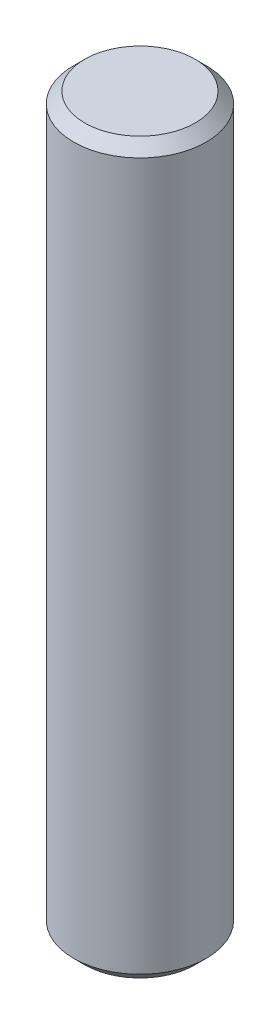
ISO-10303-21;
HEADER;
FILE_DESCRIPTION(('STEP AP214'),'2;1');
FILE_NAME('part.step','',(''),(''),'','','');
FILE_SCHEMA(('AUTOMOTIVE_DESIGN { 1 0 10303 214 1 1 1 1 }'));
ENDSEC;
DATA;
#1=APPLICATION_CONTEXT('core data for automotive mechanical design processes');
#2=APPLICATION_PROTOCOL_DEFINITION('international standard','automotive_design',2000,#1);
#3=PRODUCT_CONTEXT('',#1,'mechanical');
#4=PRODUCT('Part','Part','',(#3));
#5=PRODUCT_RELATED_PRODUCT_CATEGORY('part','',(#4));
#6=PRODUCT_DEFINITION_FORMATION('','',#4);
#7=PRODUCT_DEFINITION_CONTEXT('part definition',#1,'design');
#8=PRODUCT_DEFINITION('design','',#6,#7);
#9=PRODUCT_DEFINITION_SHAPE('','',#8);
#10=(LENGTH_UNIT() NAMED_UNIT(*) SI_UNIT(.MILLI.,.METRE.));
#11=(NAMED_UNIT(*) PLANE_ANGLE_UNIT() SI_UNIT($,.RADIAN.));
#12=(NAMED_UNIT(*) SI_UNIT($,.STERADIAN.) SOLID_ANGLE_UNIT());
#13=UNCERTAINTY_MEASURE_WITH_UNIT(LENGTH_MEASURE(1.E-05),#10,'distance_accuracy_value','');
#14=(GEOMETRIC_REPRESENTATION_CONTEXT(3) GLOBAL_UNCERTAINTY_ASSIGNED_CONTEXT((#13)) GLOBAL_UNIT_ASSIGNED_CONTEXT((#10,
#11,#12)) REPRESENTATION_CONTEXT('',''));
#15=CARTESIAN_POINT('',(0.,0.,0.));
#16=DIRECTION('',(0.,0.,1.));
#17=DIRECTION('',(1.,0.,0.));
#18=AXIS2_PLACEMENT_3D('',#15,#16,#17);
#19=CARTESIAN_POINT('',(0.,33.,0.));
#20=DIRECTION('',(0.,-1.,0.));
#21=DIRECTION('',(0.,0.,-1.));
#22=AXIS2_PLACEMENT_3D('',#19,#20,#21);
#23=CYLINDRICAL_SURFACE('',#22,3.);
#24=CARTESIAN_POINT('',(0.,0.5,0.));
#25=DIRECTION('',(0.,1.,0.));
#26=DIRECTION('',(0.,0.,1.));
#27=AXIS2_PLACEMENT_3D('',#24,#25,#26);
#28=CIRCLE('',#27,3.);
#29=CARTESIAN_POINT('',(0.,0.5,3.));
#30=VERTEX_POINT('',#29);
#31=EDGE_CURVE('E42',#30,#30,#28,.T.);
#32=ORIENTED_EDGE('',*,*,#31,.T.);
#33=EDGE_LOOP('',(#32));
#34=FACE_BOUND('',#33,.T.);
#35=CARTESIAN_POINT('',(0.,32.5,0.));
#36=DIRECTION('',(0.,1.,0.));
#37=DIRECTION('',(0.,0.,1.));
#38=AXIS2_PLACEMENT_3D('',#35,#36,#37);
#39=CIRCLE('',#38,3.);
#40=CARTESIAN_POINT('',(0.,32.5,3.));
#41=VERTEX_POINT('',#40);
#42=EDGE_CURVE('E46',#41,#41,#39,.F.);
#43=ORIENTED_EDGE('',*,*,#42,.T.);
#44=EDGE_LOOP('',(#43));
#45=FACE_BOUND('',#44,.T.);
#46=ADVANCED_FACE('F31',(#34,#45),#23,.T.);
#47=CARTESIAN_POINT('',(0.,33.,0.));
#48=DIRECTION('',(0.,1.,0.));
#49=DIRECTION('',(0.,0.,1.));
#50=AXIS2_PLACEMENT_3D('',#47,#48,#49);
#51=PLANE('',#50);
#52=CARTESIAN_POINT('',(0.,33.,0.));
#53=DIRECTION('',(0.,1.,0.));
#54=DIRECTION('',(0.,0.,1.));
#55=AXIS2_PLACEMENT_3D('',#52,#53,#54);
#56=CIRCLE('',#55,2.5);
#57=CARTESIAN_POINT('',(0.,33.,2.5));
#58=VERTEX_POINT('',#57);
#59=EDGE_CURVE('E10',#58,#58,#56,.T.);
#60=ORIENTED_EDGE('',*,*,#59,.T.);
#61=EDGE_LOOP('',(#60));
#62=FACE_BOUND('',#61,.T.);
#63=ADVANCED_FACE('F62',(#62),#51,.T.);
#64=CARTESIAN_POINT('',(0.,0.,0.));
#65=DIRECTION('',(0.,1.,0.));
#66=DIRECTION('',(0.,0.,1.));
#67=AXIS2_PLACEMENT_3D('',#64,#65,#66);
#68=PLANE('',#67);
#69=CARTESIAN_POINT('',(0.,0.,0.));
#70=DIRECTION('',(0.,1.,0.));
#71=DIRECTION('',(0.,0.,1.));
#72=AXIS2_PLACEMENT_3D('',#69,#70,#71);
#73=CIRCLE('',#72,2.5);
#74=CARTESIAN_POINT('',(0.,0.,2.5));
#75=VERTEX_POINT('',#74);
#76=EDGE_CURVE('E38',#75,#75,#73,.F.);
#77=ORIENTED_EDGE('',*,*,#76,.T.);
#78=EDGE_LOOP('',(#77));
#79=FACE_BOUND('',#78,.T.);
#80=ADVANCED_FACE('F59',(#79),#68,.F.);
#81=CARTESIAN_POINT('',(0.,0.5,0.));
#82=DIRECTION('',(0.,1.,0.));
#83=DIRECTION('',(0.,0.,1.));
#84=AXIS2_PLACEMENT_3D('',#81,#82,#83);
#85=CONICAL_SURFACE('',#84,3.,0.785398163397449);
#86=ORIENTED_EDGE('',*,*,#76,.F.);
#87=EDGE_LOOP('',(#86));
#88=FACE_BOUND('',#87,.T.);
#89=ORIENTED_EDGE('',*,*,#31,.F.);
#90=EDGE_LOOP('',(#89));
#91=FACE_BOUND('',#90,.T.);
#92=ADVANCED_FACE('F55',(#88,#91),#85,.T.);
#93=CARTESIAN_POINT('',(0.,33.,0.));
#94=DIRECTION('',(0.,-1.,0.));
#95=DIRECTION('',(0.,0.,-1.));
#96=AXIS2_PLACEMENT_3D('',#93,#94,#95);
#97=CONICAL_SURFACE('',#96,2.5,0.785398163397443);
#98=ORIENTED_EDGE('',*,*,#42,.F.);
#99=EDGE_LOOP('',(#98));
#100=FACE_BOUND('',#99,.T.);
#101=ORIENTED_EDGE('',*,*,#59,.F.);
#102=EDGE_LOOP('',(#101));
#103=FACE_BOUND('',#102,.T.);
#104=ADVANCED_FACE('F33',(#100,#103),#97,.T.);
#105=CLOSED_SHELL('',(#46,#63,#80,#92,#104));
#106=MANIFOLD_SOLID_BREP('B2',#105);
#107=ADVANCED_BREP_SHAPE_REPRESENTATION('',(#18,#106),#14);
#108=SHAPE_DEFINITION_REPRESENTATION(#9,#107);
ENDSEC;
END-ISO-10303-21;
